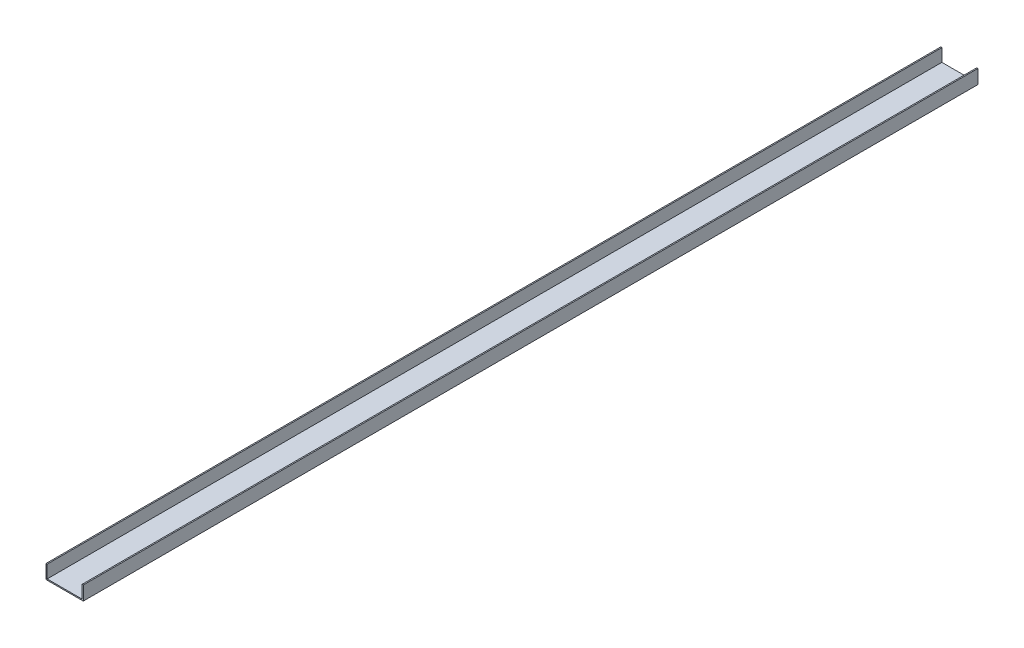
ISO-10303-21;
HEADER;
FILE_DESCRIPTION(('STEP AP214'),'2;1');
FILE_NAME('part.step','',(''),(''),'','','');
FILE_SCHEMA(('AUTOMOTIVE_DESIGN { 1 0 10303 214 1 1 1 1 }'));
ENDSEC;
DATA;
#1=APPLICATION_CONTEXT('core data for automotive mechanical design processes');
#2=APPLICATION_PROTOCOL_DEFINITION('international standard','automotive_design',2000,#1);
#3=PRODUCT_CONTEXT('',#1,'mechanical');
#4=PRODUCT('Part','Part','',(#3));
#5=PRODUCT_RELATED_PRODUCT_CATEGORY('part','',(#4));
#6=PRODUCT_DEFINITION_FORMATION('','',#4);
#7=PRODUCT_DEFINITION_CONTEXT('part definition',#1,'design');
#8=PRODUCT_DEFINITION('design','',#6,#7);
#9=PRODUCT_DEFINITION_SHAPE('','',#8);
#10=(LENGTH_UNIT() NAMED_UNIT(*) SI_UNIT(.MILLI.,.METRE.));
#11=(NAMED_UNIT(*) PLANE_ANGLE_UNIT() SI_UNIT($,.RADIAN.));
#12=(NAMED_UNIT(*) SI_UNIT($,.STERADIAN.) SOLID_ANGLE_UNIT());
#13=UNCERTAINTY_MEASURE_WITH_UNIT(LENGTH_MEASURE(1.E-05),#10,'distance_accuracy_value','');
#14=(GEOMETRIC_REPRESENTATION_CONTEXT(3) GLOBAL_UNCERTAINTY_ASSIGNED_CONTEXT((#13)) GLOBAL_UNIT_ASSIGNED_CONTEXT((#10,
#11,#12)) REPRESENTATION_CONTEXT('',''));
#15=CARTESIAN_POINT('',(0.,0.,0.));
#16=DIRECTION('',(0.,0.,1.));
#17=DIRECTION('',(1.,0.,0.));
#18=AXIS2_PLACEMENT_3D('',#15,#16,#17);
#19=CARTESIAN_POINT('',(-23.8125,9.525,609.6));
#20=DIRECTION('',(0.,-1.,0.));
#21=DIRECTION('',(1.,0.,0.));
#22=AXIS2_PLACEMENT_3D('',#19,#20,#21);
#23=PLANE('',#22);
#24=DIRECTION('',(-1.,0.,0.));
#25=VECTOR('',#24,1.);
#26=CARTESIAN_POINT('',(-23.8125,9.525,-609.6));
#27=LINE('',#26,#25);
#28=CARTESIAN_POINT('',(-23.8125,9.525,-609.6));
#29=VERTEX_POINT('',#28);
#30=CARTESIAN_POINT('',(-25.4,9.52499999999999,-609.6));
#31=VERTEX_POINT('',#30);
#32=EDGE_CURVE('E142',#29,#31,#27,.T.);
#33=ORIENTED_EDGE('',*,*,#32,.T.);
#34=DIRECTION('',(0.,0.,-1.));
#35=VECTOR('',#34,1.);
#36=CARTESIAN_POINT('',(-25.4,9.52499999999999,609.6));
#37=LINE('',#36,#35);
#38=CARTESIAN_POINT('',(-25.4,9.52499999999999,609.6));
#39=VERTEX_POINT('',#38);
#40=EDGE_CURVE('E11',#39,#31,#37,.T.);
#41=ORIENTED_EDGE('',*,*,#40,.F.);
#42=DIRECTION('',(-1.,0.,0.));
#43=VECTOR('',#42,1.);
#44=CARTESIAN_POINT('',(-23.8125,9.525,609.6));
#45=LINE('',#44,#43);
#46=CARTESIAN_POINT('',(-23.8125,9.525,609.6));
#47=VERTEX_POINT('',#46);
#48=EDGE_CURVE('E164',#47,#39,#45,.T.);
#49=ORIENTED_EDGE('',*,*,#48,.F.);
#50=DIRECTION('',(0.,0.,-1.));
#51=VECTOR('',#50,1.);
#52=CARTESIAN_POINT('',(-23.8125,9.525,609.6));
#53=LINE('',#52,#51);
#54=EDGE_CURVE('E138',#47,#29,#53,.T.);
#55=ORIENTED_EDGE('',*,*,#54,.T.);
#56=EDGE_LOOP('',(#33,#41,#49,#55));
#57=FACE_BOUND('',#56,.T.);
#58=ADVANCED_FACE('F41',(#57),#23,.F.);
#59=CARTESIAN_POINT('',(-25.4,9.52499999999999,609.6));
#60=DIRECTION('',(1.,0.,0.));
#61=DIRECTION('',(0.,1.,0.));
#62=AXIS2_PLACEMENT_3D('',#59,#60,#61);
#63=PLANE('',#62);
#64=DIRECTION('',(0.,-1.,0.));
#65=VECTOR('',#64,1.);
#66=CARTESIAN_POINT('',(-25.4,9.52499999999999,-609.6));
#67=LINE('',#66,#65);
#68=CARTESIAN_POINT('',(-25.4,-9.52500000000001,-609.6));
#69=VERTEX_POINT('',#68);
#70=EDGE_CURVE('E146',#31,#69,#67,.T.);
#71=ORIENTED_EDGE('',*,*,#70,.T.);
#72=DIRECTION('',(0.,0.,-1.));
#73=VECTOR('',#72,1.);
#74=CARTESIAN_POINT('',(-25.4,-9.52500000000001,609.6));
#75=LINE('',#74,#73);
#76=CARTESIAN_POINT('',(-25.4,-9.52500000000001,609.6));
#77=VERTEX_POINT('',#76);
#78=EDGE_CURVE('E50',#77,#69,#75,.T.);
#79=ORIENTED_EDGE('',*,*,#78,.F.);
#80=DIRECTION('',(0.,-1.,0.));
#81=VECTOR('',#80,1.);
#82=CARTESIAN_POINT('',(-25.4,9.52499999999999,609.6));
#83=LINE('',#82,#81);
#84=EDGE_CURVE('E101',#39,#77,#83,.T.);
#85=ORIENTED_EDGE('',*,*,#84,.F.);
#86=ORIENTED_EDGE('',*,*,#40,.T.);
#87=EDGE_LOOP('',(#71,#79,#85,#86));
#88=FACE_BOUND('',#87,.T.);
#89=ADVANCED_FACE('F210',(#88),#63,.F.);
#90=CARTESIAN_POINT('',(-25.4,-9.52500000000001,609.6));
#91=DIRECTION('',(0.,1.,0.));
#92=DIRECTION('',(0.,0.,1.));
#93=AXIS2_PLACEMENT_3D('',#90,#91,#92);
#94=PLANE('',#93);
#95=DIRECTION('',(1.,0.,0.));
#96=VECTOR('',#95,1.);
#97=CARTESIAN_POINT('',(-25.4,-9.52500000000001,-609.6));
#98=LINE('',#97,#96);
#99=CARTESIAN_POINT('',(25.4,-9.52500000000001,-609.6));
#100=VERTEX_POINT('',#99);
#101=EDGE_CURVE('E149',#69,#100,#98,.T.);
#102=ORIENTED_EDGE('',*,*,#101,.T.);
#103=DIRECTION('',(0.,0.,-1.));
#104=VECTOR('',#103,1.);
#105=CARTESIAN_POINT('',(25.4,-9.52500000000001,609.6));
#106=LINE('',#105,#104);
#107=CARTESIAN_POINT('',(25.4,-9.52500000000001,609.6));
#108=VERTEX_POINT('',#107);
#109=EDGE_CURVE('E175',#108,#100,#106,.T.);
#110=ORIENTED_EDGE('',*,*,#109,.F.);
#111=DIRECTION('',(1.,0.,0.));
#112=VECTOR('',#111,1.);
#113=CARTESIAN_POINT('',(-25.4,-9.52500000000001,609.6));
#114=LINE('',#113,#112);
#115=EDGE_CURVE('E185',#77,#108,#114,.T.);
#116=ORIENTED_EDGE('',*,*,#115,.F.);
#117=ORIENTED_EDGE('',*,*,#78,.T.);
#118=EDGE_LOOP('',(#102,#110,#116,#117));
#119=FACE_BOUND('',#118,.T.);
#120=ADVANCED_FACE('F183',(#119),#94,.F.);
#121=CARTESIAN_POINT('',(25.4,-9.52500000000001,609.6));
#122=DIRECTION('',(-1.,0.,0.));
#123=DIRECTION('',(0.,0.,1.));
#124=AXIS2_PLACEMENT_3D('',#121,#122,#123);
#125=PLANE('',#124);
#126=DIRECTION('',(0.,1.,0.));
#127=VECTOR('',#126,1.);
#128=CARTESIAN_POINT('',(25.4,-9.52500000000001,-609.6));
#129=LINE('',#128,#127);
#130=CARTESIAN_POINT('',(25.4,9.525,-609.6));
#131=VERTEX_POINT('',#130);
#132=EDGE_CURVE('E152',#100,#131,#129,.T.);
#133=ORIENTED_EDGE('',*,*,#132,.T.);
#134=DIRECTION('',(0.,0.,-1.));
#135=VECTOR('',#134,1.);
#136=CARTESIAN_POINT('',(25.4,9.525,609.6));
#137=LINE('',#136,#135);
#138=CARTESIAN_POINT('',(25.4,9.525,609.6));
#139=VERTEX_POINT('',#138);
#140=EDGE_CURVE('E171',#139,#131,#137,.T.);
#141=ORIENTED_EDGE('',*,*,#140,.F.);
#142=DIRECTION('',(0.,1.,0.));
#143=VECTOR('',#142,1.);
#144=CARTESIAN_POINT('',(25.4,-9.52500000000001,609.6));
#145=LINE('',#144,#143);
#146=EDGE_CURVE('E198',#108,#139,#145,.T.);
#147=ORIENTED_EDGE('',*,*,#146,.F.);
#148=ORIENTED_EDGE('',*,*,#109,.T.);
#149=EDGE_LOOP('',(#133,#141,#147,#148));
#150=FACE_BOUND('',#149,.T.);
#151=ADVANCED_FACE('F193',(#150),#125,.F.);
#152=CARTESIAN_POINT('',(25.4,9.525,609.6));
#153=DIRECTION('',(0.,-1.,0.));
#154=DIRECTION('',(1.,0.,0.));
#155=AXIS2_PLACEMENT_3D('',#152,#153,#154);
#156=PLANE('',#155);
#157=DIRECTION('',(-1.,0.,0.));
#158=VECTOR('',#157,1.);
#159=CARTESIAN_POINT('',(25.4,9.525,-609.6));
#160=LINE('',#159,#158);
#161=CARTESIAN_POINT('',(23.8125,9.525,-609.6));
#162=VERTEX_POINT('',#161);
#163=EDGE_CURVE('E155',#131,#162,#160,.T.);
#164=ORIENTED_EDGE('',*,*,#163,.T.);
#165=DIRECTION('',(0.,0.,-1.));
#166=VECTOR('',#165,1.);
#167=CARTESIAN_POINT('',(23.8125,9.525,609.6));
#168=LINE('',#167,#166);
#169=CARTESIAN_POINT('',(23.8125,9.525,609.6));
#170=VERTEX_POINT('',#169);
#171=EDGE_CURVE('E131',#170,#162,#168,.T.);
#172=ORIENTED_EDGE('',*,*,#171,.F.);
#173=DIRECTION('',(-1.,0.,0.));
#174=VECTOR('',#173,1.);
#175=CARTESIAN_POINT('',(25.4,9.525,609.6));
#176=LINE('',#175,#174);
#177=EDGE_CURVE('E120',#139,#170,#176,.T.);
#178=ORIENTED_EDGE('',*,*,#177,.F.);
#179=ORIENTED_EDGE('',*,*,#140,.T.);
#180=EDGE_LOOP('',(#164,#172,#178,#179));
#181=FACE_BOUND('',#180,.T.);
#182=ADVANCED_FACE('F196',(#181),#156,.F.);
#183=CARTESIAN_POINT('',(23.8125,9.525,609.6));
#184=DIRECTION('',(1.,0.,0.));
#185=DIRECTION('',(0.,1.,0.));
#186=AXIS2_PLACEMENT_3D('',#183,#184,#185);
#187=PLANE('',#186);
#188=DIRECTION('',(0.,-1.,0.));
#189=VECTOR('',#188,1.);
#190=CARTESIAN_POINT('',(23.8125,9.525,-609.6));
#191=LINE('',#190,#189);
#192=CARTESIAN_POINT('',(23.8125,-7.9375,-609.6));
#193=VERTEX_POINT('',#192);
#194=EDGE_CURVE('E129',#162,#193,#191,.T.);
#195=ORIENTED_EDGE('',*,*,#194,.T.);
#196=DIRECTION('',(0.,0.,-1.));
#197=VECTOR('',#196,1.);
#198=CARTESIAN_POINT('',(23.8125,-7.9375,609.6));
#199=LINE('',#198,#197);
#200=CARTESIAN_POINT('',(23.8125,-7.9375,609.6));
#201=VERTEX_POINT('',#200);
#202=EDGE_CURVE('E126',#201,#193,#199,.T.);
#203=ORIENTED_EDGE('',*,*,#202,.F.);
#204=DIRECTION('',(0.,-1.,0.));
#205=VECTOR('',#204,1.);
#206=CARTESIAN_POINT('',(23.8125,9.525,609.6));
#207=LINE('',#206,#205);
#208=EDGE_CURVE('E114',#170,#201,#207,.T.);
#209=ORIENTED_EDGE('',*,*,#208,.F.);
#210=ORIENTED_EDGE('',*,*,#171,.T.);
#211=EDGE_LOOP('',(#195,#203,#209,#210));
#212=FACE_BOUND('',#211,.T.);
#213=ADVANCED_FACE('F127',(#212),#187,.F.);
#214=CARTESIAN_POINT('',(23.8125,-7.9375,609.6));
#215=DIRECTION('',(0.,-1.,0.));
#216=DIRECTION('',(1.,0.,0.));
#217=AXIS2_PLACEMENT_3D('',#214,#215,#216);
#218=PLANE('',#217);
#219=DIRECTION('',(-1.,0.,0.));
#220=VECTOR('',#219,1.);
#221=CARTESIAN_POINT('',(23.8125,-7.9375,-609.6));
#222=LINE('',#221,#220);
#223=CARTESIAN_POINT('',(-23.8125,-7.93750000000001,-609.6));
#224=VERTEX_POINT('',#223);
#225=EDGE_CURVE('E87',#193,#224,#222,.T.);
#226=ORIENTED_EDGE('',*,*,#225,.T.);
#227=DIRECTION('',(0.,0.,-1.));
#228=VECTOR('',#227,1.);
#229=CARTESIAN_POINT('',(-23.8125,-7.93750000000001,609.6));
#230=LINE('',#229,#228);
#231=CARTESIAN_POINT('',(-23.8125,-7.93750000000001,609.6));
#232=VERTEX_POINT('',#231);
#233=EDGE_CURVE('E132',#232,#224,#230,.T.);
#234=ORIENTED_EDGE('',*,*,#233,.F.);
#235=DIRECTION('',(-1.,0.,0.));
#236=VECTOR('',#235,1.);
#237=CARTESIAN_POINT('',(23.8125,-7.9375,609.6));
#238=LINE('',#237,#236);
#239=EDGE_CURVE('E118',#201,#232,#238,.T.);
#240=ORIENTED_EDGE('',*,*,#239,.F.);
#241=ORIENTED_EDGE('',*,*,#202,.T.);
#242=EDGE_LOOP('',(#226,#234,#240,#241));
#243=FACE_BOUND('',#242,.T.);
#244=ADVANCED_FACE('F134',(#243),#218,.F.);
#245=CARTESIAN_POINT('',(-23.8125,-7.93750000000001,609.6));
#246=DIRECTION('',(-1.,0.,0.));
#247=DIRECTION('',(0.,0.,1.));
#248=AXIS2_PLACEMENT_3D('',#245,#246,#247);
#249=PLANE('',#248);
#250=DIRECTION('',(0.,1.,0.));
#251=VECTOR('',#250,1.);
#252=CARTESIAN_POINT('',(-23.8125,-7.93750000000001,-609.6));
#253=LINE('',#252,#251);
#254=EDGE_CURVE('E93',#224,#29,#253,.T.);
#255=ORIENTED_EDGE('',*,*,#254,.T.);
#256=ORIENTED_EDGE('',*,*,#54,.F.);
#257=DIRECTION('',(0.,1.,0.));
#258=VECTOR('',#257,1.);
#259=CARTESIAN_POINT('',(-23.8125,-7.93750000000001,609.6));
#260=LINE('',#259,#258);
#261=EDGE_CURVE('E58',#232,#47,#260,.T.);
#262=ORIENTED_EDGE('',*,*,#261,.F.);
#263=ORIENTED_EDGE('',*,*,#233,.T.);
#264=EDGE_LOOP('',(#255,#256,#262,#263));
#265=FACE_BOUND('',#264,.T.);
#266=ADVANCED_FACE('F226',(#265),#249,.F.);
#267=CARTESIAN_POINT('',(0.,0.,609.6));
#268=DIRECTION('',(0.,0.,1.));
#269=DIRECTION('',(1.,0.,0.));
#270=AXIS2_PLACEMENT_3D('',#267,#268,#269);
#271=PLANE('',#270);
#272=ORIENTED_EDGE('',*,*,#48,.T.);
#273=ORIENTED_EDGE('',*,*,#84,.T.);
#274=ORIENTED_EDGE('',*,*,#115,.T.);
#275=ORIENTED_EDGE('',*,*,#146,.T.);
#276=ORIENTED_EDGE('',*,*,#177,.T.);
#277=ORIENTED_EDGE('',*,*,#208,.T.);
#278=ORIENTED_EDGE('',*,*,#239,.T.);
#279=ORIENTED_EDGE('',*,*,#261,.T.);
#280=EDGE_LOOP('',(#272,#273,#274,#275,#276,#277,#278,#279));
#281=FACE_BOUND('',#280,.T.);
#282=ADVANCED_FACE('F116',(#281),#271,.T.);
#283=CARTESIAN_POINT('',(0.,0.,-609.6));
#284=DIRECTION('',(0.,0.,1.));
#285=DIRECTION('',(1.,0.,0.));
#286=AXIS2_PLACEMENT_3D('',#283,#284,#285);
#287=PLANE('',#286);
#288=ORIENTED_EDGE('',*,*,#32,.F.);
#289=ORIENTED_EDGE('',*,*,#254,.F.);
#290=ORIENTED_EDGE('',*,*,#225,.F.);
#291=ORIENTED_EDGE('',*,*,#194,.F.);
#292=ORIENTED_EDGE('',*,*,#163,.F.);
#293=ORIENTED_EDGE('',*,*,#132,.F.);
#294=ORIENTED_EDGE('',*,*,#101,.F.);
#295=ORIENTED_EDGE('',*,*,#70,.F.);
#296=EDGE_LOOP('',(#288,#289,#290,#291,#292,#293,#294,#295));
#297=FACE_BOUND('',#296,.T.);
#298=ADVANCED_FACE('F189',(#297),#287,.F.);
#299=CLOSED_SHELL('',(#58,#89,#120,#151,#182,#213,#244,#266,#282,#298));
#300=MANIFOLD_SOLID_BREP('B2',#299);
#301=ADVANCED_BREP_SHAPE_REPRESENTATION('',(#18,#300),#14);
#302=SHAPE_DEFINITION_REPRESENTATION(#9,#301);
ENDSEC;
END-ISO-10303-21;
